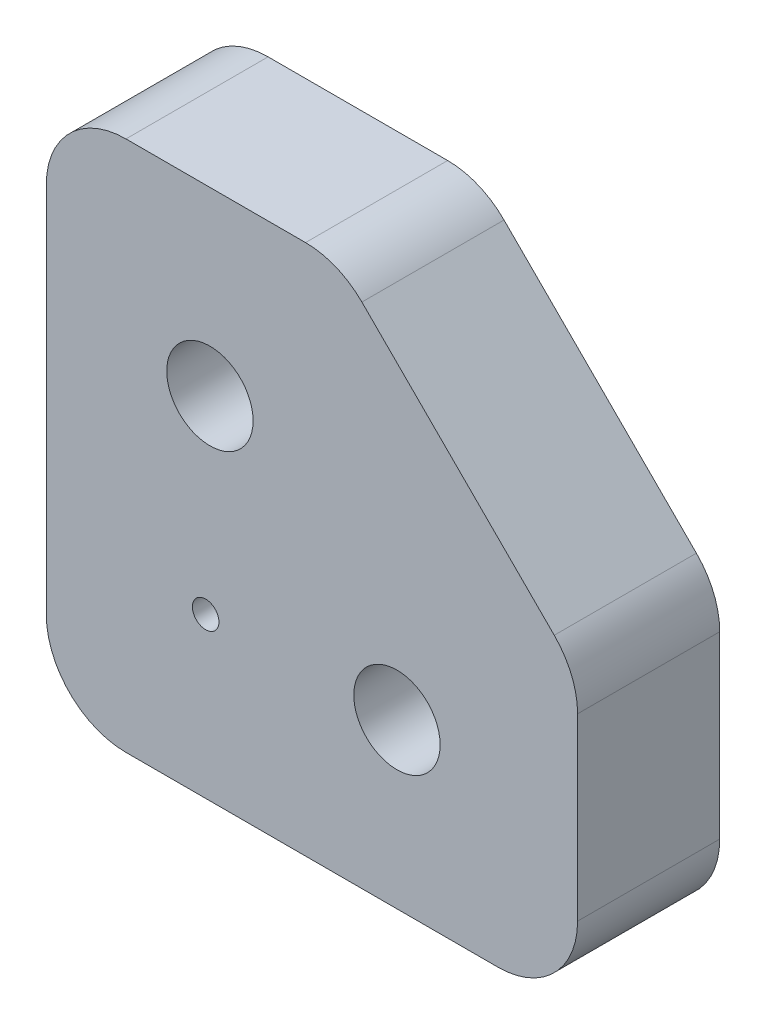
ISO-10303-21;
HEADER;
FILE_DESCRIPTION(('STEP AP214'),'2;1');
FILE_NAME('part.step','',(''),(''),'','','');
FILE_SCHEMA(('AUTOMOTIVE_DESIGN { 1 0 10303 214 1 1 1 1 }'));
ENDSEC;
DATA;
#1=APPLICATION_CONTEXT('core data for automotive mechanical design processes');
#2=APPLICATION_PROTOCOL_DEFINITION('international standard','automotive_design',2000,#1);
#3=PRODUCT_CONTEXT('',#1,'mechanical');
#4=PRODUCT('Part','Part','',(#3));
#5=PRODUCT_RELATED_PRODUCT_CATEGORY('part','',(#4));
#6=PRODUCT_DEFINITION_FORMATION('','',#4);
#7=PRODUCT_DEFINITION_CONTEXT('part definition',#1,'design');
#8=PRODUCT_DEFINITION('design','',#6,#7);
#9=PRODUCT_DEFINITION_SHAPE('','',#8);
#10=(LENGTH_UNIT() NAMED_UNIT(*) SI_UNIT(.MILLI.,.METRE.));
#11=(NAMED_UNIT(*) PLANE_ANGLE_UNIT() SI_UNIT($,.RADIAN.));
#12=(NAMED_UNIT(*) SI_UNIT($,.STERADIAN.) SOLID_ANGLE_UNIT());
#13=UNCERTAINTY_MEASURE_WITH_UNIT(LENGTH_MEASURE(1.E-05),#10,'distance_accuracy_value','');
#14=(GEOMETRIC_REPRESENTATION_CONTEXT(3) GLOBAL_UNCERTAINTY_ASSIGNED_CONTEXT((#13)) GLOBAL_UNIT_ASSIGNED_CONTEXT((#10,
#11,#12)) REPRESENTATION_CONTEXT('',''));
#15=CARTESIAN_POINT('',(0.,0.,0.));
#16=DIRECTION('',(0.,0.,1.));
#17=DIRECTION('',(1.,0.,0.));
#18=AXIS2_PLACEMENT_3D('',#15,#16,#17);
#19=CARTESIAN_POINT('',(10.5009336238846,10.5009336238844,5.35));
#20=DIRECTION('',(0.707106781186551,0.707106781186544,0.));
#21=DIRECTION('',(-0.707106781186544,0.707106781186551,0.));
#22=AXIS2_PLACEMENT_3D('',#19,#20,#21);
#23=PLANE('',#22);
#24=DIRECTION('',(0.707106781186544,-0.707106781186551,0.));
#25=VECTOR('',#24,1.);
#26=CARTESIAN_POINT('',(10.5009336238846,10.5009336238844,0.));
#27=LINE('',#26,#25);
#28=CARTESIAN_POINT('',(1.88054690420945,19.1213203435596,0.));
#29=VERTEX_POINT('',#28);
#30=CARTESIAN_POINT('',(9.12132034355965,11.8805469042093,0.));
#31=VERTEX_POINT('',#30);
#32=EDGE_CURVE('E165',#29,#31,#27,.T.);
#33=ORIENTED_EDGE('',*,*,#32,.F.);
#34=DIRECTION('',(0.,0.,-1.));
#35=VECTOR('',#34,1.);
#36=CARTESIAN_POINT('',(1.88054690420945,19.1213203435596,5.35));
#37=LINE('',#36,#35);
#38=CARTESIAN_POINT('',(1.88054690420945,19.1213203435596,5.35));
#39=VERTEX_POINT('',#38);
#40=EDGE_CURVE('E11',#39,#29,#37,.T.);
#41=ORIENTED_EDGE('',*,*,#40,.F.);
#42=DIRECTION('',(0.707106781186544,-0.707106781186551,0.));
#43=VECTOR('',#42,1.);
#44=CARTESIAN_POINT('',(10.5009336238846,10.5009336238844,5.35));
#45=LINE('',#44,#43);
#46=CARTESIAN_POINT('',(9.12132034355965,11.8805469042093,5.35));
#47=VERTEX_POINT('',#46);
#48=EDGE_CURVE('E360',#39,#47,#45,.T.);
#49=ORIENTED_EDGE('',*,*,#48,.T.);
#50=DIRECTION('',(0.,0.,-1.));
#51=VECTOR('',#50,1.);
#52=CARTESIAN_POINT('',(9.12132034355965,11.8805469042093,5.35));
#53=LINE('',#52,#51);
#54=EDGE_CURVE('E91',#47,#31,#53,.T.);
#55=ORIENTED_EDGE('',*,*,#54,.T.);
#56=EDGE_LOOP('',(#33,#41,#49,#55));
#57=FACE_BOUND('',#56,.T.);
#58=ADVANCED_FACE('F34',(#57),#23,.T.);
#59=CARTESIAN_POINT('',(-0.240773439350206,17.,5.35));
#60=DIRECTION('',(0.,0.,-1.));
#61=DIRECTION('',(-1.,0.,0.));
#62=AXIS2_PLACEMENT_3D('',#59,#60,#61);
#63=CYLINDRICAL_SURFACE('',#62,3.);
#64=CARTESIAN_POINT('',(-0.240773439350206,17.,0.));
#65=DIRECTION('',(0.,0.,1.));
#66=DIRECTION('',(1.,0.,0.));
#67=AXIS2_PLACEMENT_3D('',#64,#65,#66);
#68=CIRCLE('',#67,3.);
#69=CARTESIAN_POINT('',(-0.240773439350206,20.,0.));
#70=VERTEX_POINT('',#69);
#71=EDGE_CURVE('E163',#29,#70,#68,.T.);
#72=ORIENTED_EDGE('',*,*,#71,.T.);
#73=DIRECTION('',(0.,0.,-1.));
#74=VECTOR('',#73,1.);
#75=CARTESIAN_POINT('',(-0.240773439350206,20.,5.35));
#76=LINE('',#75,#74);
#77=CARTESIAN_POINT('',(-0.240773439350206,20.,5.35));
#78=VERTEX_POINT('',#77);
#79=EDGE_CURVE('E43',#78,#70,#76,.T.);
#80=ORIENTED_EDGE('',*,*,#79,.F.);
#81=CARTESIAN_POINT('',(-0.240773439350206,17.,5.35));
#82=DIRECTION('',(0.,0.,1.));
#83=DIRECTION('',(1.,0.,0.));
#84=AXIS2_PLACEMENT_3D('',#81,#82,#83);
#85=CIRCLE('',#84,3.);
#86=EDGE_CURVE('E358',#39,#78,#85,.T.);
#87=ORIENTED_EDGE('',*,*,#86,.F.);
#88=ORIENTED_EDGE('',*,*,#40,.T.);
#89=EDGE_LOOP('',(#72,#80,#87,#88));
#90=FACE_BOUND('',#89,.T.);
#91=ADVANCED_FACE('F164',(#90),#63,.T.);
#92=CARTESIAN_POINT('',(0.,20.,5.35));
#93=DIRECTION('',(0.,1.,0.));
#94=DIRECTION('',(-1.,0.,0.));
#95=AXIS2_PLACEMENT_3D('',#92,#93,#94);
#96=PLANE('',#95);
#97=DIRECTION('',(1.,0.,0.));
#98=VECTOR('',#97,1.);
#99=CARTESIAN_POINT('',(0.,20.,0.));
#100=LINE('',#99,#98);
#101=CARTESIAN_POINT('',(-7.,20.,0.));
#102=VERTEX_POINT('',#101);
#103=EDGE_CURVE('E158',#102,#70,#100,.T.);
#104=ORIENTED_EDGE('',*,*,#103,.F.);
#105=DIRECTION('',(0.,0.,-1.));
#106=VECTOR('',#105,1.);
#107=CARTESIAN_POINT('',(-7.,20.,5.35));
#108=LINE('',#107,#106);
#109=CARTESIAN_POINT('',(-7.,20.,5.35));
#110=VERTEX_POINT('',#109);
#111=EDGE_CURVE('E150',#110,#102,#108,.T.);
#112=ORIENTED_EDGE('',*,*,#111,.F.);
#113=DIRECTION('',(1.,0.,0.));
#114=VECTOR('',#113,1.);
#115=CARTESIAN_POINT('',(0.,20.,5.35));
#116=LINE('',#115,#114);
#117=EDGE_CURVE('E160',#110,#78,#116,.T.);
#118=ORIENTED_EDGE('',*,*,#117,.T.);
#119=ORIENTED_EDGE('',*,*,#79,.T.);
#120=EDGE_LOOP('',(#104,#112,#118,#119));
#121=FACE_BOUND('',#120,.T.);
#122=ADVANCED_FACE('F156',(#121),#96,.T.);
#123=CARTESIAN_POINT('',(-7.,17.,5.35));
#124=DIRECTION('',(0.,0.,-1.));
#125=DIRECTION('',(-1.,0.,0.));
#126=AXIS2_PLACEMENT_3D('',#123,#124,#125);
#127=CYLINDRICAL_SURFACE('',#126,3.);
#128=CARTESIAN_POINT('',(-7.,17.,0.));
#129=DIRECTION('',(0.,0.,1.));
#130=DIRECTION('',(1.,0.,0.));
#131=AXIS2_PLACEMENT_3D('',#128,#129,#130);
#132=CIRCLE('',#131,3.);
#133=CARTESIAN_POINT('',(-10.,17.,0.));
#134=VERTEX_POINT('',#133);
#135=EDGE_CURVE('E171',#102,#134,#132,.T.);
#136=ORIENTED_EDGE('',*,*,#135,.T.);
#137=DIRECTION('',(0.,0.,-1.));
#138=VECTOR('',#137,1.);
#139=CARTESIAN_POINT('',(-10.,17.,5.35));
#140=LINE('',#139,#138);
#141=CARTESIAN_POINT('',(-10.,17.,5.35));
#142=VERTEX_POINT('',#141);
#143=EDGE_CURVE('E148',#142,#134,#140,.T.);
#144=ORIENTED_EDGE('',*,*,#143,.F.);
#145=CARTESIAN_POINT('',(-7.,17.,5.35));
#146=DIRECTION('',(0.,0.,1.));
#147=DIRECTION('',(1.,0.,0.));
#148=AXIS2_PLACEMENT_3D('',#145,#146,#147);
#149=CIRCLE('',#148,3.);
#150=EDGE_CURVE('E351',#110,#142,#149,.T.);
#151=ORIENTED_EDGE('',*,*,#150,.F.);
#152=ORIENTED_EDGE('',*,*,#111,.T.);
#153=EDGE_LOOP('',(#136,#144,#151,#152));
#154=FACE_BOUND('',#153,.T.);
#155=ADVANCED_FACE('F253',(#154),#127,.T.);
#156=CARTESIAN_POINT('',(-10.,0.,5.35));
#157=DIRECTION('',(-1.,0.,0.));
#158=DIRECTION('',(0.,-1.,0.));
#159=AXIS2_PLACEMENT_3D('',#156,#157,#158);
#160=PLANE('',#159);
#161=DIRECTION('',(0.,1.,0.));
#162=VECTOR('',#161,1.);
#163=CARTESIAN_POINT('',(-10.,0.,0.));
#164=LINE('',#163,#162);
#165=CARTESIAN_POINT('',(-10.,3.,0.));
#166=VERTEX_POINT('',#165);
#167=EDGE_CURVE('E173',#166,#134,#164,.T.);
#168=ORIENTED_EDGE('',*,*,#167,.F.);
#169=DIRECTION('',(0.,0.,-1.));
#170=VECTOR('',#169,1.);
#171=CARTESIAN_POINT('',(-10.,3.,5.35));
#172=LINE('',#171,#170);
#173=CARTESIAN_POINT('',(-10.,3.,5.35));
#174=VERTEX_POINT('',#173);
#175=EDGE_CURVE('E146',#174,#166,#172,.T.);
#176=ORIENTED_EDGE('',*,*,#175,.F.);
#177=DIRECTION('',(0.,1.,0.));
#178=VECTOR('',#177,1.);
#179=CARTESIAN_POINT('',(-10.,0.,5.35));
#180=LINE('',#179,#178);
#181=EDGE_CURVE('E349',#174,#142,#180,.T.);
#182=ORIENTED_EDGE('',*,*,#181,.T.);
#183=ORIENTED_EDGE('',*,*,#143,.T.);
#184=EDGE_LOOP('',(#168,#176,#182,#183));
#185=FACE_BOUND('',#184,.T.);
#186=ADVANCED_FACE('F249',(#185),#160,.T.);
#187=CARTESIAN_POINT('',(-7.,3.,5.35));
#188=DIRECTION('',(0.,0.,-1.));
#189=DIRECTION('',(-1.,0.,0.));
#190=AXIS2_PLACEMENT_3D('',#187,#188,#189);
#191=CYLINDRICAL_SURFACE('',#190,3.);
#192=CARTESIAN_POINT('',(-7.,3.,0.));
#193=DIRECTION('',(0.,0.,1.));
#194=DIRECTION('',(1.,0.,0.));
#195=AXIS2_PLACEMENT_3D('',#192,#193,#194);
#196=CIRCLE('',#195,3.);
#197=CARTESIAN_POINT('',(-7.,0.,0.));
#198=VERTEX_POINT('',#197);
#199=EDGE_CURVE('E178',#166,#198,#196,.T.);
#200=ORIENTED_EDGE('',*,*,#199,.T.);
#201=DIRECTION('',(0.,0.,-1.));
#202=VECTOR('',#201,1.);
#203=CARTESIAN_POINT('',(-7.,0.,5.35));
#204=LINE('',#203,#202);
#205=CARTESIAN_POINT('',(-7.,0.,5.35));
#206=VERTEX_POINT('',#205);
#207=EDGE_CURVE('E139',#206,#198,#204,.T.);
#208=ORIENTED_EDGE('',*,*,#207,.F.);
#209=CARTESIAN_POINT('',(-7.,3.,5.35));
#210=DIRECTION('',(0.,0.,1.));
#211=DIRECTION('',(1.,0.,0.));
#212=AXIS2_PLACEMENT_3D('',#209,#210,#211);
#213=CIRCLE('',#212,3.);
#214=EDGE_CURVE('E350',#174,#206,#213,.T.);
#215=ORIENTED_EDGE('',*,*,#214,.F.);
#216=ORIENTED_EDGE('',*,*,#175,.T.);
#217=EDGE_LOOP('',(#200,#208,#215,#216));
#218=FACE_BOUND('',#217,.T.);
#219=ADVANCED_FACE('F245',(#218),#191,.T.);
#220=CARTESIAN_POINT('',(0.,0.,5.35));
#221=DIRECTION('',(0.,1.,0.));
#222=DIRECTION('',(0.,0.,1.));
#223=AXIS2_PLACEMENT_3D('',#220,#221,#222);
#224=PLANE('',#223);
#225=DIRECTION('',(1.,0.,0.));
#226=VECTOR('',#225,1.);
#227=CARTESIAN_POINT('',(0.,0.,0.));
#228=LINE('',#227,#226);
#229=CARTESIAN_POINT('',(7.,0.,0.));
#230=VERTEX_POINT('',#229);
#231=EDGE_CURVE('E181',#198,#230,#228,.T.);
#232=ORIENTED_EDGE('',*,*,#231,.T.);
#233=DIRECTION('',(0.,0.,-1.));
#234=VECTOR('',#233,1.);
#235=CARTESIAN_POINT('',(7.,0.,5.35));
#236=LINE('',#235,#234);
#237=CARTESIAN_POINT('',(7.,0.,5.35));
#238=VERTEX_POINT('',#237);
#239=EDGE_CURVE('E137',#238,#230,#236,.T.);
#240=ORIENTED_EDGE('',*,*,#239,.F.);
#241=DIRECTION('',(1.,0.,0.));
#242=VECTOR('',#241,1.);
#243=CARTESIAN_POINT('',(0.,0.,5.35));
#244=LINE('',#243,#242);
#245=EDGE_CURVE('E130',#206,#238,#244,.T.);
#246=ORIENTED_EDGE('',*,*,#245,.F.);
#247=ORIENTED_EDGE('',*,*,#207,.T.);
#248=EDGE_LOOP('',(#232,#240,#246,#247));
#249=FACE_BOUND('',#248,.T.);
#250=ADVANCED_FACE('F242',(#249),#224,.F.);
#251=CARTESIAN_POINT('',(7.,3.,5.35));
#252=DIRECTION('',(0.,0.,-1.));
#253=DIRECTION('',(-1.,0.,0.));
#254=AXIS2_PLACEMENT_3D('',#251,#252,#253);
#255=CYLINDRICAL_SURFACE('',#254,3.);
#256=CARTESIAN_POINT('',(7.,3.,0.));
#257=DIRECTION('',(0.,0.,1.));
#258=DIRECTION('',(1.,0.,0.));
#259=AXIS2_PLACEMENT_3D('',#256,#257,#258);
#260=CIRCLE('',#259,3.);
#261=CARTESIAN_POINT('',(10.,3.,0.));
#262=VERTEX_POINT('',#261);
#263=EDGE_CURVE('E136',#230,#262,#260,.T.);
#264=ORIENTED_EDGE('',*,*,#263,.T.);
#265=DIRECTION('',(0.,0.,-1.));
#266=VECTOR('',#265,1.);
#267=CARTESIAN_POINT('',(10.,3.,5.35));
#268=LINE('',#267,#266);
#269=CARTESIAN_POINT('',(10.,3.,5.35));
#270=VERTEX_POINT('',#269);
#271=EDGE_CURVE('E122',#270,#262,#268,.T.);
#272=ORIENTED_EDGE('',*,*,#271,.F.);
#273=CARTESIAN_POINT('',(7.,3.,5.35));
#274=DIRECTION('',(0.,0.,1.));
#275=DIRECTION('',(1.,0.,0.));
#276=AXIS2_PLACEMENT_3D('',#273,#274,#275);
#277=CIRCLE('',#276,3.);
#278=EDGE_CURVE('E125',#238,#270,#277,.T.);
#279=ORIENTED_EDGE('',*,*,#278,.F.);
#280=ORIENTED_EDGE('',*,*,#239,.T.);
#281=EDGE_LOOP('',(#264,#272,#279,#280));
#282=FACE_BOUND('',#281,.T.);
#283=ADVANCED_FACE('F135',(#282),#255,.T.);
#284=CARTESIAN_POINT('',(10.,0.,5.35));
#285=DIRECTION('',(-1.,0.,0.));
#286=DIRECTION('',(0.,-1.,0.));
#287=AXIS2_PLACEMENT_3D('',#284,#285,#286);
#288=PLANE('',#287);
#289=DIRECTION('',(0.,1.,0.));
#290=VECTOR('',#289,1.);
#291=CARTESIAN_POINT('',(10.,0.,0.));
#292=LINE('',#291,#290);
#293=CARTESIAN_POINT('',(10.,9.75922656064971,0.));
#294=VERTEX_POINT('',#293);
#295=EDGE_CURVE('E185',#262,#294,#292,.T.);
#296=ORIENTED_EDGE('',*,*,#295,.T.);
#297=DIRECTION('',(0.,0.,-1.));
#298=VECTOR('',#297,1.);
#299=CARTESIAN_POINT('',(10.,9.75922656064971,5.35));
#300=LINE('',#299,#298);
#301=CARTESIAN_POINT('',(10.,9.75922656064971,5.35));
#302=VERTEX_POINT('',#301);
#303=EDGE_CURVE('E124',#302,#294,#300,.T.);
#304=ORIENTED_EDGE('',*,*,#303,.F.);
#305=DIRECTION('',(0.,1.,0.));
#306=VECTOR('',#305,1.);
#307=CARTESIAN_POINT('',(10.,0.,5.35));
#308=LINE('',#307,#306);
#309=EDGE_CURVE('E117',#270,#302,#308,.T.);
#310=ORIENTED_EDGE('',*,*,#309,.F.);
#311=ORIENTED_EDGE('',*,*,#271,.T.);
#312=EDGE_LOOP('',(#296,#304,#310,#311));
#313=FACE_BOUND('',#312,.T.);
#314=ADVANCED_FACE('F120',(#313),#288,.F.);
#315=CARTESIAN_POINT('',(-4.,6.,5.35));
#316=DIRECTION('',(0.,0.,-1.));
#317=DIRECTION('',(-1.,0.,0.));
#318=AXIS2_PLACEMENT_3D('',#315,#316,#317);
#319=CYLINDRICAL_SURFACE('',#318,0.500000000000001);
#320=CARTESIAN_POINT('',(-4.,6.,5.35));
#321=DIRECTION('',(0.,0.,1.));
#322=DIRECTION('',(1.,0.,0.));
#323=AXIS2_PLACEMENT_3D('',#320,#321,#322);
#324=CIRCLE('',#323,0.500000000000001);
#325=CARTESIAN_POINT('',(-3.5,6.,5.35));
#326=VERTEX_POINT('',#325);
#327=EDGE_CURVE('E362',#326,#326,#324,.T.);
#328=ORIENTED_EDGE('',*,*,#327,.T.);
#329=EDGE_LOOP('',(#328));
#330=FACE_BOUND('',#329,.T.);
#331=CARTESIAN_POINT('',(-4.,6.,0.));
#332=DIRECTION('',(0.,0.,1.));
#333=DIRECTION('',(1.,0.,0.));
#334=AXIS2_PLACEMENT_3D('',#331,#332,#333);
#335=CIRCLE('',#334,0.500000000000001);
#336=CARTESIAN_POINT('',(-3.5,6.,0.));
#337=VERTEX_POINT('',#336);
#338=EDGE_CURVE('E196',#337,#337,#335,.T.);
#339=ORIENTED_EDGE('',*,*,#338,.F.);
#340=EDGE_LOOP('',(#339));
#341=FACE_BOUND('',#340,.T.);
#342=ADVANCED_FACE('F206',(#330,#341),#319,.F.);
#343=CARTESIAN_POINT('',(-3.84,13.2,5.35));
#344=DIRECTION('',(0.,0.,-1.));
#345=DIRECTION('',(-1.,0.,0.));
#346=AXIS2_PLACEMENT_3D('',#343,#344,#345);
#347=CYLINDRICAL_SURFACE('',#346,1.625);
#348=CARTESIAN_POINT('',(-3.84,13.2,5.35));
#349=DIRECTION('',(0.,0.,1.));
#350=DIRECTION('',(1.,0.,0.));
#351=AXIS2_PLACEMENT_3D('',#348,#349,#350);
#352=CIRCLE('',#351,1.625);
#353=CARTESIAN_POINT('',(-2.215,13.2,5.35));
#354=VERTEX_POINT('',#353);
#355=EDGE_CURVE('E220',#354,#354,#352,.T.);
#356=ORIENTED_EDGE('',*,*,#355,.T.);
#357=EDGE_LOOP('',(#356));
#358=FACE_BOUND('',#357,.T.);
#359=CARTESIAN_POINT('',(-3.84,13.2,0.));
#360=DIRECTION('',(0.,0.,1.));
#361=DIRECTION('',(1.,0.,0.));
#362=AXIS2_PLACEMENT_3D('',#359,#360,#361);
#363=CIRCLE('',#362,1.625);
#364=CARTESIAN_POINT('',(-2.215,13.2,0.));
#365=VERTEX_POINT('',#364);
#366=EDGE_CURVE('E193',#365,#365,#363,.T.);
#367=ORIENTED_EDGE('',*,*,#366,.F.);
#368=EDGE_LOOP('',(#367));
#369=FACE_BOUND('',#368,.T.);
#370=ADVANCED_FACE('F208',(#358,#369),#347,.F.);
#371=CARTESIAN_POINT('',(3.2,6.16,5.35));
#372=DIRECTION('',(0.,0.,-1.));
#373=DIRECTION('',(-1.,0.,0.));
#374=AXIS2_PLACEMENT_3D('',#371,#372,#373);
#375=CYLINDRICAL_SURFACE('',#374,1.625);
#376=CARTESIAN_POINT('',(3.2,6.16,5.35));
#377=DIRECTION('',(0.,0.,1.));
#378=DIRECTION('',(1.,0.,0.));
#379=AXIS2_PLACEMENT_3D('',#376,#377,#378);
#380=CIRCLE('',#379,1.625);
#381=CARTESIAN_POINT('',(4.825,6.16,5.35));
#382=VERTEX_POINT('',#381);
#383=EDGE_CURVE('E187',#382,#382,#380,.T.);
#384=ORIENTED_EDGE('',*,*,#383,.T.);
#385=EDGE_LOOP('',(#384));
#386=FACE_BOUND('',#385,.T.);
#387=CARTESIAN_POINT('',(3.2,6.16,0.));
#388=DIRECTION('',(0.,0.,1.));
#389=DIRECTION('',(1.,0.,0.));
#390=AXIS2_PLACEMENT_3D('',#387,#388,#389);
#391=CIRCLE('',#390,1.625);
#392=CARTESIAN_POINT('',(4.825,6.16,0.));
#393=VERTEX_POINT('',#392);
#394=EDGE_CURVE('E190',#393,#393,#391,.T.);
#395=ORIENTED_EDGE('',*,*,#394,.F.);
#396=EDGE_LOOP('',(#395));
#397=FACE_BOUND('',#396,.T.);
#398=ADVANCED_FACE('F36',(#386,#397),#375,.F.);
#399=CARTESIAN_POINT('',(7.,9.75922656064972,5.35));
#400=DIRECTION('',(0.,0.,-1.));
#401=DIRECTION('',(-1.,0.,0.));
#402=AXIS2_PLACEMENT_3D('',#399,#400,#401);
#403=CYLINDRICAL_SURFACE('',#402,3.);
#404=CARTESIAN_POINT('',(7.,9.75922656064972,0.));
#405=DIRECTION('',(0.,0.,1.));
#406=DIRECTION('',(1.,0.,0.));
#407=AXIS2_PLACEMENT_3D('',#404,#405,#406);
#408=CIRCLE('',#407,3.);
#409=EDGE_CURVE('E84',#294,#31,#408,.T.);
#410=ORIENTED_EDGE('',*,*,#409,.T.);
#411=ORIENTED_EDGE('',*,*,#54,.F.);
#412=CARTESIAN_POINT('',(7.,9.75922656064972,5.35));
#413=DIRECTION('',(0.,0.,1.));
#414=DIRECTION('',(1.,0.,0.));
#415=AXIS2_PLACEMENT_3D('',#412,#413,#414);
#416=CIRCLE('',#415,3.);
#417=EDGE_CURVE('E51',#302,#47,#416,.T.);
#418=ORIENTED_EDGE('',*,*,#417,.F.);
#419=ORIENTED_EDGE('',*,*,#303,.T.);
#420=EDGE_LOOP('',(#410,#411,#418,#419));
#421=FACE_BOUND('',#420,.T.);
#422=ADVANCED_FACE('F215',(#421),#403,.T.);
#423=CARTESIAN_POINT('',(0.,0.,5.35));
#424=DIRECTION('',(0.,0.,1.));
#425=DIRECTION('',(1.,0.,0.));
#426=AXIS2_PLACEMENT_3D('',#423,#424,#425);
#427=PLANE('',#426);
#428=ORIENTED_EDGE('',*,*,#383,.F.);
#429=EDGE_LOOP('',(#428));
#430=FACE_BOUND('',#429,.T.);
#431=ORIENTED_EDGE('',*,*,#355,.F.);
#432=EDGE_LOOP('',(#431));
#433=FACE_BOUND('',#432,.T.);
#434=ORIENTED_EDGE('',*,*,#327,.F.);
#435=EDGE_LOOP('',(#434));
#436=FACE_BOUND('',#435,.T.);
#437=ORIENTED_EDGE('',*,*,#48,.F.);
#438=ORIENTED_EDGE('',*,*,#86,.T.);
#439=ORIENTED_EDGE('',*,*,#117,.F.);
#440=ORIENTED_EDGE('',*,*,#150,.T.);
#441=ORIENTED_EDGE('',*,*,#181,.F.);
#442=ORIENTED_EDGE('',*,*,#214,.T.);
#443=ORIENTED_EDGE('',*,*,#245,.T.);
#444=ORIENTED_EDGE('',*,*,#278,.T.);
#445=ORIENTED_EDGE('',*,*,#309,.T.);
#446=ORIENTED_EDGE('',*,*,#417,.T.);
#447=EDGE_LOOP('',(#437,#438,#439,#440,#441,#442,#443,#444,#445,#446));
#448=FACE_BOUND('',#447,.T.);
#449=ADVANCED_FACE('F128',(#430,#433,#436,#448),#427,.T.);
#450=CARTESIAN_POINT('',(0.,0.,0.));
#451=DIRECTION('',(0.,0.,1.));
#452=DIRECTION('',(1.,0.,0.));
#453=AXIS2_PLACEMENT_3D('',#450,#451,#452);
#454=PLANE('',#453);
#455=ORIENTED_EDGE('',*,*,#394,.T.);
#456=EDGE_LOOP('',(#455));
#457=FACE_BOUND('',#456,.T.);
#458=ORIENTED_EDGE('',*,*,#366,.T.);
#459=EDGE_LOOP('',(#458));
#460=FACE_BOUND('',#459,.T.);
#461=ORIENTED_EDGE('',*,*,#338,.T.);
#462=EDGE_LOOP('',(#461));
#463=FACE_BOUND('',#462,.T.);
#464=ORIENTED_EDGE('',*,*,#32,.T.);
#465=ORIENTED_EDGE('',*,*,#409,.F.);
#466=ORIENTED_EDGE('',*,*,#295,.F.);
#467=ORIENTED_EDGE('',*,*,#263,.F.);
#468=ORIENTED_EDGE('',*,*,#231,.F.);
#469=ORIENTED_EDGE('',*,*,#199,.F.);
#470=ORIENTED_EDGE('',*,*,#167,.T.);
#471=ORIENTED_EDGE('',*,*,#135,.F.);
#472=ORIENTED_EDGE('',*,*,#103,.T.);
#473=ORIENTED_EDGE('',*,*,#71,.F.);
#474=EDGE_LOOP('',(#464,#465,#466,#467,#468,#469,#470,#471,#472,#473));
#475=FACE_BOUND('',#474,.T.);
#476=ADVANCED_FACE('F168',(#457,#460,#463,#475),#454,.F.);
#477=CLOSED_SHELL('',(#58,#91,#122,#155,#186,#219,#250,#283,#314,#342,#370,#398,#422,#449,#476));
#478=MANIFOLD_SOLID_BREP('B2',#477);
#479=ADVANCED_BREP_SHAPE_REPRESENTATION('',(#18,#478),#14);
#480=SHAPE_DEFINITION_REPRESENTATION(#9,#479);
ENDSEC;
END-ISO-10303-21;
